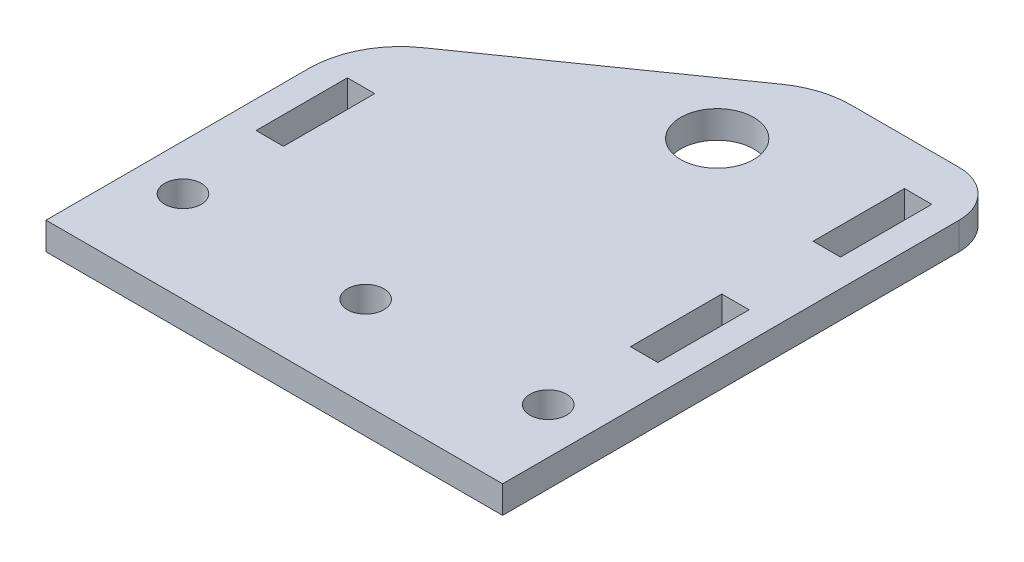
ISO-10303-21;
HEADER;
FILE_DESCRIPTION(('STEP AP214'),'2;1');
FILE_NAME('part.step','',(''),(''),'','','');
FILE_SCHEMA(('AUTOMOTIVE_DESIGN { 1 0 10303 214 1 1 1 1 }'));
ENDSEC;
DATA;
#1=APPLICATION_CONTEXT('core data for automotive mechanical design processes');
#2=APPLICATION_PROTOCOL_DEFINITION('international standard','automotive_design',2000,#1);
#3=PRODUCT_CONTEXT('',#1,'mechanical');
#4=PRODUCT('Part','Part','',(#3));
#5=PRODUCT_RELATED_PRODUCT_CATEGORY('part','',(#4));
#6=PRODUCT_DEFINITION_FORMATION('','',#4);
#7=PRODUCT_DEFINITION_CONTEXT('part definition',#1,'design');
#8=PRODUCT_DEFINITION('design','',#6,#7);
#9=PRODUCT_DEFINITION_SHAPE('','',#8);
#10=(LENGTH_UNIT() NAMED_UNIT(*) SI_UNIT(.MILLI.,.METRE.));
#11=(NAMED_UNIT(*) PLANE_ANGLE_UNIT() SI_UNIT($,.RADIAN.));
#12=(NAMED_UNIT(*) SI_UNIT($,.STERADIAN.) SOLID_ANGLE_UNIT());
#13=UNCERTAINTY_MEASURE_WITH_UNIT(LENGTH_MEASURE(1.E-05),#10,'distance_accuracy_value','');
#14=(GEOMETRIC_REPRESENTATION_CONTEXT(3) GLOBAL_UNCERTAINTY_ASSIGNED_CONTEXT((#13)) GLOBAL_UNIT_ASSIGNED_CONTEXT((#10,
#11,#12)) REPRESENTATION_CONTEXT('',''));
#15=CARTESIAN_POINT('',(0.,0.,0.));
#16=DIRECTION('',(0.,0.,1.));
#17=DIRECTION('',(1.,0.,0.));
#18=AXIS2_PLACEMENT_3D('',#15,#16,#17);
#19=CARTESIAN_POINT('',(25.,3.,0.));
#20=DIRECTION('',(1.,0.,0.));
#21=DIRECTION('',(0.,0.,-1.));
#22=AXIS2_PLACEMENT_3D('',#19,#20,#21);
#23=PLANE('',#22);
#24=DIRECTION('',(0.,0.,1.));
#25=VECTOR('',#24,1.);
#26=CARTESIAN_POINT('',(25.,0.,0.));
#27=LINE('',#26,#25);
#28=CARTESIAN_POINT('',(25.,0.,-22.5));
#29=VERTEX_POINT('',#28);
#30=CARTESIAN_POINT('',(25.,0.,27.5));
#31=VERTEX_POINT('',#30);
#32=EDGE_CURVE('E307',#29,#31,#27,.T.);
#33=ORIENTED_EDGE('',*,*,#32,.F.);
#34=DIRECTION('',(0.,-1.,0.));
#35=VECTOR('',#34,1.);
#36=CARTESIAN_POINT('',(25.,3.,-22.5));
#37=LINE('',#36,#35);
#38=CARTESIAN_POINT('',(25.,3.,-22.5));
#39=VERTEX_POINT('',#38);
#40=EDGE_CURVE('E51',#29,#39,#37,.F.);
#41=ORIENTED_EDGE('',*,*,#40,.T.);
#42=DIRECTION('',(0.,0.,1.));
#43=VECTOR('',#42,1.);
#44=CARTESIAN_POINT('',(25.,3.,0.));
#45=LINE('',#44,#43);
#46=CARTESIAN_POINT('',(25.,3.,27.5));
#47=VERTEX_POINT('',#46);
#48=EDGE_CURVE('E310',#39,#47,#45,.T.);
#49=ORIENTED_EDGE('',*,*,#48,.T.);
#50=DIRECTION('',(0.,-1.,0.));
#51=VECTOR('',#50,1.);
#52=CARTESIAN_POINT('',(25.,3.,27.5));
#53=LINE('',#52,#51);
#54=EDGE_CURVE('E321',#47,#31,#53,.T.);
#55=ORIENTED_EDGE('',*,*,#54,.T.);
#56=EDGE_LOOP('',(#33,#41,#49,#55));
#57=FACE_BOUND('',#56,.T.);
#58=ADVANCED_FACE('F43',(#57),#23,.T.);
#59=CARTESIAN_POINT('',(0.,3.,-27.5));
#60=DIRECTION('',(0.,0.,-1.));
#61=DIRECTION('',(-1.,0.,0.));
#62=AXIS2_PLACEMENT_3D('',#59,#60,#61);
#63=PLANE('',#62);
#64=DIRECTION('',(1.,0.,0.));
#65=VECTOR('',#64,1.);
#66=CARTESIAN_POINT('',(0.,3.,-27.5));
#67=LINE('',#66,#65);
#68=CARTESIAN_POINT('',(8.15298788878997,3.,-27.5));
#69=VERTEX_POINT('',#68);
#70=CARTESIAN_POINT('',(20.,3.,-27.5));
#71=VERTEX_POINT('',#70);
#72=EDGE_CURVE('E312',#69,#71,#67,.T.);
#73=ORIENTED_EDGE('',*,*,#72,.T.);
#74=DIRECTION('',(0.,-1.,0.));
#75=VECTOR('',#74,1.);
#76=CARTESIAN_POINT('',(20.,3.,-27.5));
#77=LINE('',#76,#75);
#78=CARTESIAN_POINT('',(20.,0.,-27.5));
#79=VERTEX_POINT('',#78);
#80=EDGE_CURVE('E358',#71,#79,#77,.T.);
#81=ORIENTED_EDGE('',*,*,#80,.T.);
#82=DIRECTION('',(1.,0.,0.));
#83=VECTOR('',#82,1.);
#84=CARTESIAN_POINT('',(0.,0.,-27.5));
#85=LINE('',#84,#83);
#86=CARTESIAN_POINT('',(8.15298788878997,0.,-27.5));
#87=VERTEX_POINT('',#86);
#88=EDGE_CURVE('E323',#87,#79,#85,.T.);
#89=ORIENTED_EDGE('',*,*,#88,.F.);
#90=DIRECTION('',(0.,1.,0.));
#91=VECTOR('',#90,1.);
#92=CARTESIAN_POINT('',(8.15298788878997,3.,-27.5));
#93=LINE('',#92,#91);
#94=EDGE_CURVE('E340',#87,#69,#93,.T.);
#95=ORIENTED_EDGE('',*,*,#94,.T.);
#96=EDGE_LOOP('',(#73,#81,#89,#95));
#97=FACE_BOUND('',#96,.T.);
#98=ADVANCED_FACE('F364',(#97),#63,.T.);
#99=CARTESIAN_POINT('',(-25.,3.,0.));
#100=DIRECTION('',(1.,0.,0.));
#101=DIRECTION('',(0.,0.,-1.));
#102=AXIS2_PLACEMENT_3D('',#99,#100,#101);
#103=PLANE('',#102);
#104=DIRECTION('',(0.,0.,1.));
#105=VECTOR('',#104,1.);
#106=CARTESIAN_POINT('',(-25.,3.,0.));
#107=LINE('',#106,#105);
#108=CARTESIAN_POINT('',(-25.,3.,-1.28810334819122));
#109=VERTEX_POINT('',#108);
#110=CARTESIAN_POINT('',(-25.,3.,27.5));
#111=VERTEX_POINT('',#110);
#112=EDGE_CURVE('E316',#109,#111,#107,.T.);
#113=ORIENTED_EDGE('',*,*,#112,.F.);
#114=DIRECTION('',(0.,-1.,0.));
#115=VECTOR('',#114,1.);
#116=CARTESIAN_POINT('',(-25.,0.,-1.28810334819122));
#117=LINE('',#116,#115);
#118=CARTESIAN_POINT('',(-25.,0.,-1.28810334819122));
#119=VERTEX_POINT('',#118);
#120=EDGE_CURVE('E355',#109,#119,#117,.T.);
#121=ORIENTED_EDGE('',*,*,#120,.T.);
#122=DIRECTION('',(0.,0.,1.));
#123=VECTOR('',#122,1.);
#124=CARTESIAN_POINT('',(-25.,0.,0.));
#125=LINE('',#124,#123);
#126=CARTESIAN_POINT('',(-25.,0.,27.5));
#127=VERTEX_POINT('',#126);
#128=EDGE_CURVE('E325',#119,#127,#125,.T.);
#129=ORIENTED_EDGE('',*,*,#128,.T.);
#130=DIRECTION('',(0.,-1.,0.));
#131=VECTOR('',#130,1.);
#132=CARTESIAN_POINT('',(-25.,3.,27.5));
#133=LINE('',#132,#131);
#134=EDGE_CURVE('E331',#111,#127,#133,.T.);
#135=ORIENTED_EDGE('',*,*,#134,.F.);
#136=EDGE_LOOP('',(#113,#121,#129,#135));
#137=FACE_BOUND('',#136,.T.);
#138=ADVANCED_FACE('F388',(#137),#103,.F.);
#139=CARTESIAN_POINT('',(0.,3.,27.5));
#140=DIRECTION('',(0.,0.,-1.));
#141=DIRECTION('',(-1.,0.,0.));
#142=AXIS2_PLACEMENT_3D('',#139,#140,#141);
#143=PLANE('',#142);
#144=DIRECTION('',(1.,0.,0.));
#145=VECTOR('',#144,1.);
#146=CARTESIAN_POINT('',(0.,0.,27.5));
#147=LINE('',#146,#145);
#148=EDGE_CURVE('E313',#127,#31,#147,.T.);
#149=ORIENTED_EDGE('',*,*,#148,.T.);
#150=ORIENTED_EDGE('',*,*,#54,.F.);
#151=DIRECTION('',(1.,0.,0.));
#152=VECTOR('',#151,1.);
#153=CARTESIAN_POINT('',(0.,3.,27.5));
#154=LINE('',#153,#152);
#155=EDGE_CURVE('E318',#111,#47,#154,.T.);
#156=ORIENTED_EDGE('',*,*,#155,.F.);
#157=ORIENTED_EDGE('',*,*,#134,.T.);
#158=EDGE_LOOP('',(#149,#150,#156,#157));
#159=FACE_BOUND('',#158,.T.);
#160=ADVANCED_FACE('F434',(#159),#143,.F.);
#161=CARTESIAN_POINT('',(0.,3.,0.));
#162=DIRECTION('',(0.,1.,0.));
#163=DIRECTION('',(0.,0.,1.));
#164=AXIS2_PLACEMENT_3D('',#161,#162,#163);
#165=PLANE('',#164);
#166=DIRECTION('',(-1.,0.,0.));
#167=VECTOR('',#166,1.);
#168=CARTESIAN_POINT('',(-22.,3.,-2.50000000000001));
#169=LINE('',#168,#167);
#170=CARTESIAN_POINT('',(-19.,3.,-2.50000000000001));
#171=VERTEX_POINT('',#170);
#172=CARTESIAN_POINT('',(-22.,3.,-2.50000000000001));
#173=VERTEX_POINT('',#172);
#174=EDGE_CURVE('E185',#171,#173,#169,.T.);
#175=ORIENTED_EDGE('',*,*,#174,.F.);
#176=DIRECTION('',(0.,0.,-1.));
#177=VECTOR('',#176,1.);
#178=CARTESIAN_POINT('',(-19.,3.,-2.50000000000001));
#179=LINE('',#178,#177);
#180=CARTESIAN_POINT('',(-19.,3.,7.49999999999999));
#181=VERTEX_POINT('',#180);
#182=EDGE_CURVE('E203',#181,#171,#179,.T.);
#183=ORIENTED_EDGE('',*,*,#182,.F.);
#184=DIRECTION('',(1.,0.,0.));
#185=VECTOR('',#184,1.);
#186=CARTESIAN_POINT('',(-22.,3.,7.49999999999999));
#187=LINE('',#186,#185);
#188=CARTESIAN_POINT('',(-22.,3.,7.49999999999999));
#189=VERTEX_POINT('',#188);
#190=EDGE_CURVE('E206',#189,#181,#187,.T.);
#191=ORIENTED_EDGE('',*,*,#190,.F.);
#192=DIRECTION('',(0.,0.,1.));
#193=VECTOR('',#192,1.);
#194=CARTESIAN_POINT('',(-22.,3.,-2.50000000000001));
#195=LINE('',#194,#193);
#196=EDGE_CURVE('E212',#173,#189,#195,.T.);
#197=ORIENTED_EDGE('',*,*,#196,.F.);
#198=EDGE_LOOP('',(#175,#183,#191,#197));
#199=FACE_BOUND('',#198,.T.);
#200=DIRECTION('',(0.,0.,-1.));
#201=VECTOR('',#200,1.);
#202=CARTESIAN_POINT('',(22.,3.,-2.50000000000001));
#203=LINE('',#202,#201);
#204=CARTESIAN_POINT('',(22.,3.,7.49999999999999));
#205=VERTEX_POINT('',#204);
#206=CARTESIAN_POINT('',(22.,3.,-2.50000000000001));
#207=VERTEX_POINT('',#206);
#208=EDGE_CURVE('E213',#205,#207,#203,.T.);
#209=ORIENTED_EDGE('',*,*,#208,.F.);
#210=DIRECTION('',(1.,0.,0.));
#211=VECTOR('',#210,1.);
#212=CARTESIAN_POINT('',(22.,3.,7.49999999999999));
#213=LINE('',#212,#211);
#214=CARTESIAN_POINT('',(19.,3.,7.49999999999999));
#215=VERTEX_POINT('',#214);
#216=EDGE_CURVE('E234',#215,#205,#213,.T.);
#217=ORIENTED_EDGE('',*,*,#216,.F.);
#218=DIRECTION('',(0.,0.,1.));
#219=VECTOR('',#218,1.);
#220=CARTESIAN_POINT('',(19.,3.,-2.50000000000001));
#221=LINE('',#220,#219);
#222=CARTESIAN_POINT('',(19.,3.,-2.50000000000001));
#223=VERTEX_POINT('',#222);
#224=EDGE_CURVE('E237',#223,#215,#221,.T.);
#225=ORIENTED_EDGE('',*,*,#224,.F.);
#226=DIRECTION('',(-1.,0.,0.));
#227=VECTOR('',#226,1.);
#228=CARTESIAN_POINT('',(22.,3.,-2.50000000000001));
#229=LINE('',#228,#227);
#230=EDGE_CURVE('E241',#207,#223,#229,.T.);
#231=ORIENTED_EDGE('',*,*,#230,.F.);
#232=EDGE_LOOP('',(#209,#217,#225,#231));
#233=FACE_BOUND('',#232,.T.);
#234=DIRECTION('',(-1.,0.,0.));
#235=VECTOR('',#234,1.);
#236=CARTESIAN_POINT('',(22.,3.,-22.5));
#237=LINE('',#236,#235);
#238=CARTESIAN_POINT('',(22.,3.,-22.5));
#239=VERTEX_POINT('',#238);
#240=CARTESIAN_POINT('',(19.,3.,-22.5));
#241=VERTEX_POINT('',#240);
#242=EDGE_CURVE('E233',#239,#241,#237,.T.);
#243=ORIENTED_EDGE('',*,*,#242,.F.);
#244=DIRECTION('',(0.,0.,-1.));
#245=VECTOR('',#244,1.);
#246=CARTESIAN_POINT('',(22.,3.,-22.5));
#247=LINE('',#246,#245);
#248=CARTESIAN_POINT('',(22.,3.,-12.5));
#249=VERTEX_POINT('',#248);
#250=EDGE_CURVE('E265',#249,#239,#247,.T.);
#251=ORIENTED_EDGE('',*,*,#250,.F.);
#252=DIRECTION('',(1.,0.,0.));
#253=VECTOR('',#252,1.);
#254=CARTESIAN_POINT('',(22.,3.,-12.5));
#255=LINE('',#254,#253);
#256=CARTESIAN_POINT('',(19.,3.,-12.5));
#257=VERTEX_POINT('',#256);
#258=EDGE_CURVE('E268',#257,#249,#255,.T.);
#259=ORIENTED_EDGE('',*,*,#258,.F.);
#260=DIRECTION('',(0.,0.,1.));
#261=VECTOR('',#260,1.);
#262=CARTESIAN_POINT('',(19.,3.,-22.5));
#263=LINE('',#262,#261);
#264=EDGE_CURVE('E272',#241,#257,#263,.T.);
#265=ORIENTED_EDGE('',*,*,#264,.F.);
#266=EDGE_LOOP('',(#243,#251,#259,#265));
#267=FACE_BOUND('',#266,.T.);
#268=CARTESIAN_POINT('',(-20.,3.,17.5));
#269=DIRECTION('',(0.,1.,0.));
#270=DIRECTION('',(0.,0.,1.));
#271=AXIS2_PLACEMENT_3D('',#268,#269,#270);
#272=CIRCLE('',#271,2.);
#273=CARTESIAN_POINT('',(-20.,3.,19.5));
#274=VERTEX_POINT('',#273);
#275=EDGE_CURVE('E290',#274,#274,#272,.T.);
#276=ORIENTED_EDGE('',*,*,#275,.F.);
#277=EDGE_LOOP('',(#276));
#278=FACE_BOUND('',#277,.T.);
#279=CARTESIAN_POINT('',(0.,3.,17.5));
#280=DIRECTION('',(0.,1.,0.));
#281=DIRECTION('',(0.,0.,1.));
#282=AXIS2_PLACEMENT_3D('',#279,#280,#281);
#283=CIRCLE('',#282,2.);
#284=CARTESIAN_POINT('',(0.,3.,19.5));
#285=VERTEX_POINT('',#284);
#286=EDGE_CURVE('E293',#285,#285,#283,.T.);
#287=ORIENTED_EDGE('',*,*,#286,.F.);
#288=EDGE_LOOP('',(#287));
#289=FACE_BOUND('',#288,.T.);
#290=CARTESIAN_POINT('',(20.,3.,17.5));
#291=DIRECTION('',(0.,1.,0.));
#292=DIRECTION('',(0.,0.,-1.));
#293=AXIS2_PLACEMENT_3D('',#290,#291,#292);
#294=CIRCLE('',#293,2.);
#295=CARTESIAN_POINT('',(20.,3.,15.5));
#296=VERTEX_POINT('',#295);
#297=EDGE_CURVE('E299',#296,#296,#294,.T.);
#298=ORIENTED_EDGE('',*,*,#297,.F.);
#299=EDGE_LOOP('',(#298));
#300=FACE_BOUND('',#299,.T.);
#301=CARTESIAN_POINT('',(4.,3.,-17.));
#302=DIRECTION('',(0.,1.,0.));
#303=DIRECTION('',(0.,0.,1.));
#304=AXIS2_PLACEMENT_3D('',#301,#302,#303);
#305=CIRCLE('',#304,4.00000000000001);
#306=CARTESIAN_POINT('',(4.,3.,-13.));
#307=VERTEX_POINT('',#306);
#308=EDGE_CURVE('E289',#307,#307,#305,.T.);
#309=ORIENTED_EDGE('',*,*,#308,.F.);
#310=EDGE_LOOP('',(#309));
#311=FACE_BOUND('',#310,.T.);
#312=ORIENTED_EDGE('',*,*,#48,.F.);
#313=CARTESIAN_POINT('',(20.,3.,-22.5));
#314=DIRECTION('',(0.,1.,0.));
#315=DIRECTION('',(0.,0.,1.));
#316=AXIS2_PLACEMENT_3D('',#313,#314,#315);
#317=CIRCLE('',#316,5.);
#318=EDGE_CURVE('E11',#39,#71,#317,.T.);
#319=ORIENTED_EDGE('',*,*,#318,.T.);
#320=ORIENTED_EDGE('',*,*,#72,.F.);
#321=CARTESIAN_POINT('',(8.15298788878997,3.,-17.5));
#322=DIRECTION('',(0.,1.,0.));
#323=DIRECTION('',(0.,0.,1.));
#324=AXIS2_PLACEMENT_3D('',#321,#322,#323);
#325=CIRCLE('',#324,10.);
#326=CARTESIAN_POINT('',(2.41722352527953,3.,-25.6915204428899));
#327=VERTEX_POINT('',#326);
#328=EDGE_CURVE('E345',#69,#327,#325,.T.);
#329=ORIENTED_EDGE('',*,*,#328,.T.);
#330=DIRECTION('',(-0.819152044288993,0.,0.573576436351044));
#331=VECTOR('',#330,1.);
#332=CARTESIAN_POINT('',(-11.2758238941204,3.,-16.1035454187632));
#333=LINE('',#332,#331);
#334=CARTESIAN_POINT('',(-20.7357643635105,3.,-9.47962379108116));
#335=VERTEX_POINT('',#334);
#336=EDGE_CURVE('E337',#327,#335,#333,.T.);
#337=ORIENTED_EDGE('',*,*,#336,.T.);
#338=CARTESIAN_POINT('',(-15.,3.,-1.28810334819123));
#339=DIRECTION('',(0.,1.,0.));
#340=DIRECTION('',(0.,0.,1.));
#341=AXIS2_PLACEMENT_3D('',#338,#339,#340);
#342=CIRCLE('',#341,10.);
#343=EDGE_CURVE('E343',#335,#109,#342,.T.);
#344=ORIENTED_EDGE('',*,*,#343,.T.);
#345=ORIENTED_EDGE('',*,*,#112,.T.);
#346=ORIENTED_EDGE('',*,*,#155,.T.);
#347=EDGE_LOOP('',(#312,#319,#320,#329,#337,#344,#345,#346));
#348=FACE_BOUND('',#347,.T.);
#349=ADVANCED_FACE('F375',(#199,#233,#267,#278,#289,#300,#311,#348),#165,.T.);
#350=CARTESIAN_POINT('',(0.,0.,0.));
#351=DIRECTION('',(0.,1.,0.));
#352=DIRECTION('',(0.,0.,1.));
#353=AXIS2_PLACEMENT_3D('',#350,#351,#352);
#354=PLANE('',#353);
#355=DIRECTION('',(0.,0.,-1.));
#356=VECTOR('',#355,1.);
#357=CARTESIAN_POINT('',(-19.,0.,-2.50000000000001));
#358=LINE('',#357,#356);
#359=CARTESIAN_POINT('',(-19.,0.,7.49999999999999));
#360=VERTEX_POINT('',#359);
#361=CARTESIAN_POINT('',(-19.,0.,-2.50000000000001));
#362=VERTEX_POINT('',#361);
#363=EDGE_CURVE('E190',#360,#362,#358,.T.);
#364=ORIENTED_EDGE('',*,*,#363,.T.);
#365=DIRECTION('',(-1.,0.,0.));
#366=VECTOR('',#365,1.);
#367=CARTESIAN_POINT('',(-22.,0.,-2.50000000000001));
#368=LINE('',#367,#366);
#369=CARTESIAN_POINT('',(-22.,0.,-2.50000000000001));
#370=VERTEX_POINT('',#369);
#371=EDGE_CURVE('E182',#362,#370,#368,.T.);
#372=ORIENTED_EDGE('',*,*,#371,.T.);
#373=DIRECTION('',(0.,0.,1.));
#374=VECTOR('',#373,1.);
#375=CARTESIAN_POINT('',(-22.,0.,-2.50000000000001));
#376=LINE('',#375,#374);
#377=CARTESIAN_POINT('',(-22.,0.,7.49999999999999));
#378=VERTEX_POINT('',#377);
#379=EDGE_CURVE('E194',#370,#378,#376,.T.);
#380=ORIENTED_EDGE('',*,*,#379,.T.);
#381=DIRECTION('',(1.,0.,0.));
#382=VECTOR('',#381,1.);
#383=CARTESIAN_POINT('',(-22.,0.,7.49999999999999));
#384=LINE('',#383,#382);
#385=EDGE_CURVE('E198',#378,#360,#384,.T.);
#386=ORIENTED_EDGE('',*,*,#385,.T.);
#387=EDGE_LOOP('',(#364,#372,#380,#386));
#388=FACE_BOUND('',#387,.T.);
#389=DIRECTION('',(1.,0.,0.));
#390=VECTOR('',#389,1.);
#391=CARTESIAN_POINT('',(22.,0.,7.49999999999999));
#392=LINE('',#391,#390);
#393=CARTESIAN_POINT('',(19.,0.,7.49999999999999));
#394=VERTEX_POINT('',#393);
#395=CARTESIAN_POINT('',(22.,0.,7.49999999999999));
#396=VERTEX_POINT('',#395);
#397=EDGE_CURVE('E226',#394,#396,#392,.T.);
#398=ORIENTED_EDGE('',*,*,#397,.T.);
#399=DIRECTION('',(0.,0.,-1.));
#400=VECTOR('',#399,1.);
#401=CARTESIAN_POINT('',(22.,0.,-2.50000000000001));
#402=LINE('',#401,#400);
#403=CARTESIAN_POINT('',(22.,0.,-2.50000000000001));
#404=VERTEX_POINT('',#403);
#405=EDGE_CURVE('E238',#396,#404,#402,.T.);
#406=ORIENTED_EDGE('',*,*,#405,.T.);
#407=DIRECTION('',(-1.,0.,0.));
#408=VECTOR('',#407,1.);
#409=CARTESIAN_POINT('',(22.,0.,-2.50000000000001));
#410=LINE('',#409,#408);
#411=CARTESIAN_POINT('',(19.,0.,-2.50000000000001));
#412=VERTEX_POINT('',#411);
#413=EDGE_CURVE('E250',#404,#412,#410,.T.);
#414=ORIENTED_EDGE('',*,*,#413,.T.);
#415=DIRECTION('',(0.,0.,1.));
#416=VECTOR('',#415,1.);
#417=CARTESIAN_POINT('',(19.,0.,-2.50000000000001));
#418=LINE('',#417,#416);
#419=EDGE_CURVE('E247',#412,#394,#418,.T.);
#420=ORIENTED_EDGE('',*,*,#419,.T.);
#421=EDGE_LOOP('',(#398,#406,#414,#420));
#422=FACE_BOUND('',#421,.T.);
#423=DIRECTION('',(0.,0.,-1.));
#424=VECTOR('',#423,1.);
#425=CARTESIAN_POINT('',(22.,0.,-22.5));
#426=LINE('',#425,#424);
#427=CARTESIAN_POINT('',(22.,0.,-12.5));
#428=VERTEX_POINT('',#427);
#429=CARTESIAN_POINT('',(22.,0.,-22.5));
#430=VERTEX_POINT('',#429);
#431=EDGE_CURVE('E258',#428,#430,#426,.T.);
#432=ORIENTED_EDGE('',*,*,#431,.T.);
#433=DIRECTION('',(-1.,0.,0.));
#434=VECTOR('',#433,1.);
#435=CARTESIAN_POINT('',(22.,0.,-22.5));
#436=LINE('',#435,#434);
#437=CARTESIAN_POINT('',(19.,0.,-22.5));
#438=VERTEX_POINT('',#437);
#439=EDGE_CURVE('E269',#430,#438,#436,.T.);
#440=ORIENTED_EDGE('',*,*,#439,.T.);
#441=DIRECTION('',(0.,0.,1.));
#442=VECTOR('',#441,1.);
#443=CARTESIAN_POINT('',(19.,0.,-22.5));
#444=LINE('',#443,#442);
#445=CARTESIAN_POINT('',(19.,0.,-12.5));
#446=VERTEX_POINT('',#445);
#447=EDGE_CURVE('E281',#438,#446,#444,.T.);
#448=ORIENTED_EDGE('',*,*,#447,.T.);
#449=DIRECTION('',(1.,0.,0.));
#450=VECTOR('',#449,1.);
#451=CARTESIAN_POINT('',(22.,0.,-12.5));
#452=LINE('',#451,#450);
#453=EDGE_CURVE('E278',#446,#428,#452,.T.);
#454=ORIENTED_EDGE('',*,*,#453,.T.);
#455=EDGE_LOOP('',(#432,#440,#448,#454));
#456=FACE_BOUND('',#455,.T.);
#457=CARTESIAN_POINT('',(-20.,0.,17.5));
#458=DIRECTION('',(0.,1.,0.));
#459=DIRECTION('',(0.,0.,1.));
#460=AXIS2_PLACEMENT_3D('',#457,#458,#459);
#461=CIRCLE('',#460,2.);
#462=CARTESIAN_POINT('',(-20.,0.,19.5));
#463=VERTEX_POINT('',#462);
#464=EDGE_CURVE('E286',#463,#463,#461,.T.);
#465=ORIENTED_EDGE('',*,*,#464,.T.);
#466=EDGE_LOOP('',(#465));
#467=FACE_BOUND('',#466,.T.);
#468=CARTESIAN_POINT('',(0.,0.,17.5));
#469=DIRECTION('',(0.,1.,0.));
#470=DIRECTION('',(0.,0.,1.));
#471=AXIS2_PLACEMENT_3D('',#468,#469,#470);
#472=CIRCLE('',#471,2.);
#473=CARTESIAN_POINT('',(0.,0.,19.5));
#474=VERTEX_POINT('',#473);
#475=EDGE_CURVE('E296',#474,#474,#472,.T.);
#476=ORIENTED_EDGE('',*,*,#475,.T.);
#477=EDGE_LOOP('',(#476));
#478=FACE_BOUND('',#477,.T.);
#479=CARTESIAN_POINT('',(20.,0.,17.5));
#480=DIRECTION('',(0.,1.,0.));
#481=DIRECTION('',(0.,0.,-1.));
#482=AXIS2_PLACEMENT_3D('',#479,#480,#481);
#483=CIRCLE('',#482,2.);
#484=CARTESIAN_POINT('',(20.,0.,15.5));
#485=VERTEX_POINT('',#484);
#486=EDGE_CURVE('E219',#485,#485,#483,.T.);
#487=ORIENTED_EDGE('',*,*,#486,.T.);
#488=EDGE_LOOP('',(#487));
#489=FACE_BOUND('',#488,.T.);
#490=CARTESIAN_POINT('',(4.,0.,-17.));
#491=DIRECTION('',(0.,1.,0.));
#492=DIRECTION('',(0.,0.,1.));
#493=AXIS2_PLACEMENT_3D('',#490,#491,#492);
#494=CIRCLE('',#493,4.00000000000001);
#495=CARTESIAN_POINT('',(4.,0.,-13.));
#496=VERTEX_POINT('',#495);
#497=EDGE_CURVE('E304',#496,#496,#494,.T.);
#498=ORIENTED_EDGE('',*,*,#497,.T.);
#499=EDGE_LOOP('',(#498));
#500=FACE_BOUND('',#499,.T.);
#501=ORIENTED_EDGE('',*,*,#88,.T.);
#502=CARTESIAN_POINT('',(20.,0.,-22.5));
#503=DIRECTION('',(0.,1.,0.));
#504=DIRECTION('',(0.,0.,1.));
#505=AXIS2_PLACEMENT_3D('',#502,#503,#504);
#506=CIRCLE('',#505,5.);
#507=EDGE_CURVE('E65',#79,#29,#506,.F.);
#508=ORIENTED_EDGE('',*,*,#507,.T.);
#509=ORIENTED_EDGE('',*,*,#32,.T.);
#510=ORIENTED_EDGE('',*,*,#148,.F.);
#511=ORIENTED_EDGE('',*,*,#128,.F.);
#512=CARTESIAN_POINT('',(-15.,0.,-1.28810334819123));
#513=DIRECTION('',(0.,1.,0.));
#514=DIRECTION('',(0.,0.,1.));
#515=AXIS2_PLACEMENT_3D('',#512,#513,#514);
#516=CIRCLE('',#515,10.);
#517=CARTESIAN_POINT('',(-20.7357643635104,0.,-9.47962379108116));
#518=VERTEX_POINT('',#517);
#519=EDGE_CURVE('E351',#119,#518,#516,.F.);
#520=ORIENTED_EDGE('',*,*,#519,.T.);
#521=DIRECTION('',(0.819152044288993,0.,-0.573576436351044));
#522=VECTOR('',#521,1.);
#523=CARTESIAN_POINT('',(-25.,0.,-6.49377385370871));
#524=LINE('',#523,#522);
#525=CARTESIAN_POINT('',(2.41722352527953,0.,-25.6915204428899));
#526=VERTEX_POINT('',#525);
#527=EDGE_CURVE('E334',#518,#526,#524,.T.);
#528=ORIENTED_EDGE('',*,*,#527,.T.);
#529=CARTESIAN_POINT('',(8.15298788878997,0.,-17.5));
#530=DIRECTION('',(0.,1.,0.));
#531=DIRECTION('',(0.,0.,1.));
#532=AXIS2_PLACEMENT_3D('',#529,#530,#531);
#533=CIRCLE('',#532,10.);
#534=EDGE_CURVE('E353',#526,#87,#533,.F.);
#535=ORIENTED_EDGE('',*,*,#534,.T.);
#536=EDGE_LOOP('',(#501,#508,#509,#510,#511,#520,#528,#535));
#537=FACE_BOUND('',#536,.T.);
#538=ADVANCED_FACE('F200',(#388,#422,#456,#467,#478,#489,#500,#537),#354,.F.);
#539=CARTESIAN_POINT('',(4.,0.,-17.));
#540=DIRECTION('',(0.,1.,0.));
#541=DIRECTION('',(0.,0.,1.));
#542=AXIS2_PLACEMENT_3D('',#539,#540,#541);
#543=CYLINDRICAL_SURFACE('',#542,4.00000000000001);
#544=ORIENTED_EDGE('',*,*,#497,.F.);
#545=EDGE_LOOP('',(#544));
#546=FACE_BOUND('',#545,.T.);
#547=ORIENTED_EDGE('',*,*,#308,.T.);
#548=EDGE_LOOP('',(#547));
#549=FACE_BOUND('',#548,.T.);
#550=ADVANCED_FACE('F446',(#546,#549),#543,.F.);
#551=CARTESIAN_POINT('',(20.,0.,17.5));
#552=DIRECTION('',(0.,1.,0.));
#553=DIRECTION('',(0.,0.,1.));
#554=AXIS2_PLACEMENT_3D('',#551,#552,#553);
#555=CYLINDRICAL_SURFACE('',#554,2.);
#556=ORIENTED_EDGE('',*,*,#486,.F.);
#557=EDGE_LOOP('',(#556));
#558=FACE_BOUND('',#557,.T.);
#559=ORIENTED_EDGE('',*,*,#297,.T.);
#560=EDGE_LOOP('',(#559));
#561=FACE_BOUND('',#560,.T.);
#562=ADVANCED_FACE('F600',(#558,#561),#555,.F.);
#563=CARTESIAN_POINT('',(0.,0.,17.5));
#564=DIRECTION('',(0.,1.,0.));
#565=DIRECTION('',(0.,0.,1.));
#566=AXIS2_PLACEMENT_3D('',#563,#564,#565);
#567=CYLINDRICAL_SURFACE('',#566,2.);
#568=ORIENTED_EDGE('',*,*,#475,.F.);
#569=EDGE_LOOP('',(#568));
#570=FACE_BOUND('',#569,.T.);
#571=ORIENTED_EDGE('',*,*,#286,.T.);
#572=EDGE_LOOP('',(#571));
#573=FACE_BOUND('',#572,.T.);
#574=ADVANCED_FACE('F590',(#570,#573),#567,.F.);
#575=CARTESIAN_POINT('',(-20.,0.,17.5));
#576=DIRECTION('',(0.,1.,0.));
#577=DIRECTION('',(0.,0.,1.));
#578=AXIS2_PLACEMENT_3D('',#575,#576,#577);
#579=CYLINDRICAL_SURFACE('',#578,2.);
#580=ORIENTED_EDGE('',*,*,#464,.F.);
#581=EDGE_LOOP('',(#580));
#582=FACE_BOUND('',#581,.T.);
#583=ORIENTED_EDGE('',*,*,#275,.T.);
#584=EDGE_LOOP('',(#583));
#585=FACE_BOUND('',#584,.T.);
#586=ADVANCED_FACE('F580',(#582,#585),#579,.F.);
#587=CARTESIAN_POINT('',(22.,0.,-22.5));
#588=DIRECTION('',(0.,0.,-1.));
#589=DIRECTION('',(-1.,0.,0.));
#590=AXIS2_PLACEMENT_3D('',#587,#588,#589);
#591=PLANE('',#590);
#592=ORIENTED_EDGE('',*,*,#242,.T.);
#593=DIRECTION('',(0.,1.,0.));
#594=VECTOR('',#593,1.);
#595=CARTESIAN_POINT('',(19.,0.,-22.5));
#596=LINE('',#595,#594);
#597=EDGE_CURVE('E255',#438,#241,#596,.T.);
#598=ORIENTED_EDGE('',*,*,#597,.F.);
#599=ORIENTED_EDGE('',*,*,#439,.F.);
#600=DIRECTION('',(0.,1.,0.));
#601=VECTOR('',#600,1.);
#602=CARTESIAN_POINT('',(22.,0.,-22.5));
#603=LINE('',#602,#601);
#604=EDGE_CURVE('E263',#430,#239,#603,.T.);
#605=ORIENTED_EDGE('',*,*,#604,.T.);
#606=EDGE_LOOP('',(#592,#598,#599,#605));
#607=FACE_BOUND('',#606,.T.);
#608=ADVANCED_FACE('F570',(#607),#591,.F.);
#609=CARTESIAN_POINT('',(22.,0.,-22.5));
#610=DIRECTION('',(1.,0.,0.));
#611=DIRECTION('',(0.,0.,-1.));
#612=AXIS2_PLACEMENT_3D('',#609,#610,#611);
#613=PLANE('',#612);
#614=ORIENTED_EDGE('',*,*,#250,.T.);
#615=ORIENTED_EDGE('',*,*,#604,.F.);
#616=ORIENTED_EDGE('',*,*,#431,.F.);
#617=DIRECTION('',(0.,1.,0.));
#618=VECTOR('',#617,1.);
#619=CARTESIAN_POINT('',(22.,0.,-12.5));
#620=LINE('',#619,#618);
#621=EDGE_CURVE('E261',#428,#249,#620,.T.);
#622=ORIENTED_EDGE('',*,*,#621,.T.);
#623=EDGE_LOOP('',(#614,#615,#616,#622));
#624=FACE_BOUND('',#623,.T.);
#625=ADVANCED_FACE('F560',(#624),#613,.F.);
#626=CARTESIAN_POINT('',(22.,0.,-12.5));
#627=DIRECTION('',(0.,0.,1.));
#628=DIRECTION('',(1.,0.,0.));
#629=AXIS2_PLACEMENT_3D('',#626,#627,#628);
#630=PLANE('',#629);
#631=ORIENTED_EDGE('',*,*,#258,.T.);
#632=ORIENTED_EDGE('',*,*,#621,.F.);
#633=ORIENTED_EDGE('',*,*,#453,.F.);
#634=DIRECTION('',(0.,1.,0.));
#635=VECTOR('',#634,1.);
#636=CARTESIAN_POINT('',(19.,0.,-12.5));
#637=LINE('',#636,#635);
#638=EDGE_CURVE('E259',#446,#257,#637,.T.);
#639=ORIENTED_EDGE('',*,*,#638,.T.);
#640=EDGE_LOOP('',(#631,#632,#633,#639));
#641=FACE_BOUND('',#640,.T.);
#642=ADVANCED_FACE('F550',(#641),#630,.F.);
#643=CARTESIAN_POINT('',(19.,0.,-22.5));
#644=DIRECTION('',(-1.,0.,0.));
#645=DIRECTION('',(0.,0.,1.));
#646=AXIS2_PLACEMENT_3D('',#643,#644,#645);
#647=PLANE('',#646);
#648=ORIENTED_EDGE('',*,*,#264,.T.);
#649=ORIENTED_EDGE('',*,*,#638,.F.);
#650=ORIENTED_EDGE('',*,*,#447,.F.);
#651=ORIENTED_EDGE('',*,*,#597,.T.);
#652=EDGE_LOOP('',(#648,#649,#650,#651));
#653=FACE_BOUND('',#652,.T.);
#654=ADVANCED_FACE('F540',(#653),#647,.F.);
#655=CARTESIAN_POINT('',(22.,0.,-2.50000000000001));
#656=DIRECTION('',(1.,0.,0.));
#657=DIRECTION('',(0.,0.,-1.));
#658=AXIS2_PLACEMENT_3D('',#655,#656,#657);
#659=PLANE('',#658);
#660=ORIENTED_EDGE('',*,*,#208,.T.);
#661=DIRECTION('',(0.,1.,0.));
#662=VECTOR('',#661,1.);
#663=CARTESIAN_POINT('',(22.,0.,-2.50000000000001));
#664=LINE('',#663,#662);
#665=EDGE_CURVE('E223',#404,#207,#664,.T.);
#666=ORIENTED_EDGE('',*,*,#665,.F.);
#667=ORIENTED_EDGE('',*,*,#405,.F.);
#668=DIRECTION('',(0.,1.,0.));
#669=VECTOR('',#668,1.);
#670=CARTESIAN_POINT('',(22.,0.,7.49999999999999));
#671=LINE('',#670,#669);
#672=EDGE_CURVE('E231',#396,#205,#671,.T.);
#673=ORIENTED_EDGE('',*,*,#672,.T.);
#674=EDGE_LOOP('',(#660,#666,#667,#673));
#675=FACE_BOUND('',#674,.T.);
#676=ADVANCED_FACE('F530',(#675),#659,.F.);
#677=CARTESIAN_POINT('',(22.,0.,7.49999999999999));
#678=DIRECTION('',(0.,0.,1.));
#679=DIRECTION('',(1.,0.,0.));
#680=AXIS2_PLACEMENT_3D('',#677,#678,#679);
#681=PLANE('',#680);
#682=ORIENTED_EDGE('',*,*,#216,.T.);
#683=ORIENTED_EDGE('',*,*,#672,.F.);
#684=ORIENTED_EDGE('',*,*,#397,.F.);
#685=DIRECTION('',(0.,1.,0.));
#686=VECTOR('',#685,1.);
#687=CARTESIAN_POINT('',(19.,0.,7.49999999999999));
#688=LINE('',#687,#686);
#689=EDGE_CURVE('E229',#394,#215,#688,.T.);
#690=ORIENTED_EDGE('',*,*,#689,.T.);
#691=EDGE_LOOP('',(#682,#683,#684,#690));
#692=FACE_BOUND('',#691,.T.);
#693=ADVANCED_FACE('F520',(#692),#681,.F.);
#694=CARTESIAN_POINT('',(19.,0.,-2.50000000000001));
#695=DIRECTION('',(-1.,0.,0.));
#696=DIRECTION('',(0.,0.,1.));
#697=AXIS2_PLACEMENT_3D('',#694,#695,#696);
#698=PLANE('',#697);
#699=ORIENTED_EDGE('',*,*,#224,.T.);
#700=ORIENTED_EDGE('',*,*,#689,.F.);
#701=ORIENTED_EDGE('',*,*,#419,.F.);
#702=DIRECTION('',(0.,1.,0.));
#703=VECTOR('',#702,1.);
#704=CARTESIAN_POINT('',(19.,0.,-2.50000000000001));
#705=LINE('',#704,#703);
#706=EDGE_CURVE('E227',#412,#223,#705,.T.);
#707=ORIENTED_EDGE('',*,*,#706,.T.);
#708=EDGE_LOOP('',(#699,#700,#701,#707));
#709=FACE_BOUND('',#708,.T.);
#710=ADVANCED_FACE('F510',(#709),#698,.F.);
#711=CARTESIAN_POINT('',(22.,0.,-2.50000000000001));
#712=DIRECTION('',(0.,0.,-1.));
#713=DIRECTION('',(-1.,0.,0.));
#714=AXIS2_PLACEMENT_3D('',#711,#712,#713);
#715=PLANE('',#714);
#716=ORIENTED_EDGE('',*,*,#230,.T.);
#717=ORIENTED_EDGE('',*,*,#706,.F.);
#718=ORIENTED_EDGE('',*,*,#413,.F.);
#719=ORIENTED_EDGE('',*,*,#665,.T.);
#720=EDGE_LOOP('',(#716,#717,#718,#719));
#721=FACE_BOUND('',#720,.T.);
#722=ADVANCED_FACE('F501',(#721),#715,.F.);
#723=CARTESIAN_POINT('',(-22.,0.,-2.50000000000001));
#724=DIRECTION('',(0.,0.,-1.));
#725=DIRECTION('',(-1.,0.,0.));
#726=AXIS2_PLACEMENT_3D('',#723,#724,#725);
#727=PLANE('',#726);
#728=ORIENTED_EDGE('',*,*,#174,.T.);
#729=DIRECTION('',(0.,1.,0.));
#730=VECTOR('',#729,1.);
#731=CARTESIAN_POINT('',(-22.,0.,-2.50000000000001));
#732=LINE('',#731,#730);
#733=EDGE_CURVE('E178',#370,#173,#732,.T.);
#734=ORIENTED_EDGE('',*,*,#733,.F.);
#735=ORIENTED_EDGE('',*,*,#371,.F.);
#736=DIRECTION('',(0.,1.,0.));
#737=VECTOR('',#736,1.);
#738=CARTESIAN_POINT('',(-19.,0.,-2.50000000000001));
#739=LINE('',#738,#737);
#740=EDGE_CURVE('E217',#362,#171,#739,.T.);
#741=ORIENTED_EDGE('',*,*,#740,.T.);
#742=EDGE_LOOP('',(#728,#734,#735,#741));
#743=FACE_BOUND('',#742,.T.);
#744=ADVANCED_FACE('F180',(#743),#727,.F.);
#745=CARTESIAN_POINT('',(-19.,0.,-2.50000000000001));
#746=DIRECTION('',(1.,0.,0.));
#747=DIRECTION('',(0.,0.,-1.));
#748=AXIS2_PLACEMENT_3D('',#745,#746,#747);
#749=PLANE('',#748);
#750=ORIENTED_EDGE('',*,*,#182,.T.);
#751=ORIENTED_EDGE('',*,*,#740,.F.);
#752=ORIENTED_EDGE('',*,*,#363,.F.);
#753=DIRECTION('',(0.,1.,0.));
#754=VECTOR('',#753,1.);
#755=CARTESIAN_POINT('',(-19.,0.,7.49999999999999));
#756=LINE('',#755,#754);
#757=EDGE_CURVE('E220',#360,#181,#756,.T.);
#758=ORIENTED_EDGE('',*,*,#757,.T.);
#759=EDGE_LOOP('',(#750,#751,#752,#758));
#760=FACE_BOUND('',#759,.T.);
#761=ADVANCED_FACE('F482',(#760),#749,.F.);
#762=CARTESIAN_POINT('',(-22.,0.,7.49999999999999));
#763=DIRECTION('',(0.,0.,1.));
#764=DIRECTION('',(1.,0.,0.));
#765=AXIS2_PLACEMENT_3D('',#762,#763,#764);
#766=PLANE('',#765);
#767=ORIENTED_EDGE('',*,*,#190,.T.);
#768=ORIENTED_EDGE('',*,*,#757,.F.);
#769=ORIENTED_EDGE('',*,*,#385,.F.);
#770=DIRECTION('',(0.,1.,0.));
#771=VECTOR('',#770,1.);
#772=CARTESIAN_POINT('',(-22.,0.,7.49999999999999));
#773=LINE('',#772,#771);
#774=EDGE_CURVE('E189',#378,#189,#773,.T.);
#775=ORIENTED_EDGE('',*,*,#774,.T.);
#776=EDGE_LOOP('',(#767,#768,#769,#775));
#777=FACE_BOUND('',#776,.T.);
#778=ADVANCED_FACE('F473',(#777),#766,.F.);
#779=CARTESIAN_POINT('',(-22.,0.,-2.50000000000001));
#780=DIRECTION('',(-1.,0.,0.));
#781=DIRECTION('',(0.,0.,1.));
#782=AXIS2_PLACEMENT_3D('',#779,#780,#781);
#783=PLANE('',#782);
#784=ORIENTED_EDGE('',*,*,#196,.T.);
#785=ORIENTED_EDGE('',*,*,#774,.F.);
#786=ORIENTED_EDGE('',*,*,#379,.F.);
#787=ORIENTED_EDGE('',*,*,#733,.T.);
#788=EDGE_LOOP('',(#784,#785,#786,#787));
#789=FACE_BOUND('',#788,.T.);
#790=ADVANCED_FACE('F195',(#789),#783,.F.);
#791=CARTESIAN_POINT('',(-25.,3.,-6.49377385370871));
#792=DIRECTION('',(-0.573576436351044,0.,-0.819152044288993));
#793=DIRECTION('',(0.,1.,0.));
#794=AXIS2_PLACEMENT_3D('',#791,#792,#793);
#795=PLANE('',#794);
#796=ORIENTED_EDGE('',*,*,#336,.F.);
#797=DIRECTION('',(0.,1.,0.));
#798=VECTOR('',#797,1.);
#799=CARTESIAN_POINT('',(2.41722352527953,3.,-25.6915204428899));
#800=LINE('',#799,#798);
#801=EDGE_CURVE('E349',#327,#526,#800,.F.);
#802=ORIENTED_EDGE('',*,*,#801,.T.);
#803=ORIENTED_EDGE('',*,*,#527,.F.);
#804=DIRECTION('',(0.,-1.,0.));
#805=VECTOR('',#804,1.);
#806=CARTESIAN_POINT('',(-20.7357643635105,3.,-9.47962379108116));
#807=LINE('',#806,#805);
#808=EDGE_CURVE('E347',#518,#335,#807,.F.);
#809=ORIENTED_EDGE('',*,*,#808,.T.);
#810=EDGE_LOOP('',(#796,#802,#803,#809));
#811=FACE_BOUND('',#810,.T.);
#812=ADVANCED_FACE('F393',(#811),#795,.T.);
#813=CARTESIAN_POINT('',(8.15298788878997,3.,-17.5));
#814=DIRECTION('',(0.,1.,0.));
#815=DIRECTION('',(0.,0.,1.));
#816=AXIS2_PLACEMENT_3D('',#813,#814,#815);
#817=CYLINDRICAL_SURFACE('',#816,10.);
#818=ORIENTED_EDGE('',*,*,#534,.F.);
#819=ORIENTED_EDGE('',*,*,#801,.F.);
#820=ORIENTED_EDGE('',*,*,#328,.F.);
#821=ORIENTED_EDGE('',*,*,#94,.F.);
#822=EDGE_LOOP('',(#818,#819,#820,#821));
#823=FACE_BOUND('',#822,.T.);
#824=ADVANCED_FACE('F373',(#823),#817,.T.);
#825=CARTESIAN_POINT('',(-15.,3.,-1.28810334819123));
#826=DIRECTION('',(0.,1.,0.));
#827=DIRECTION('',(0.,0.,1.));
#828=AXIS2_PLACEMENT_3D('',#825,#826,#827);
#829=CYLINDRICAL_SURFACE('',#828,10.);
#830=ORIENTED_EDGE('',*,*,#343,.F.);
#831=ORIENTED_EDGE('',*,*,#808,.F.);
#832=ORIENTED_EDGE('',*,*,#519,.F.);
#833=ORIENTED_EDGE('',*,*,#120,.F.);
#834=EDGE_LOOP('',(#830,#831,#832,#833));
#835=FACE_BOUND('',#834,.T.);
#836=ADVANCED_FACE('F378',(#835),#829,.T.);
#837=CARTESIAN_POINT('',(20.,3.,-22.5));
#838=DIRECTION('',(0.,-1.,0.));
#839=DIRECTION('',(0.,0.,-1.));
#840=AXIS2_PLACEMENT_3D('',#837,#838,#839);
#841=CYLINDRICAL_SURFACE('',#840,5.);
#842=ORIENTED_EDGE('',*,*,#318,.F.);
#843=ORIENTED_EDGE('',*,*,#40,.F.);
#844=ORIENTED_EDGE('',*,*,#507,.F.);
#845=ORIENTED_EDGE('',*,*,#80,.F.);
#846=EDGE_LOOP('',(#842,#843,#844,#845));
#847=FACE_BOUND('',#846,.T.);
#848=ADVANCED_FACE('F45',(#847),#841,.T.);
#849=CLOSED_SHELL('',(#58,#98,#138,#160,#349,#538,#550,#562,#574,#586,#608,#625,#642,#654,#676,
#693,#710,#722,#744,#761,#778,#790,#812,#824,#836,#848));
#850=MANIFOLD_SOLID_BREP('B2',#849);
#851=ADVANCED_BREP_SHAPE_REPRESENTATION('',(#18,#850),#14);
#852=SHAPE_DEFINITION_REPRESENTATION(#9,#851);
ENDSEC;
END-ISO-10303-21;
